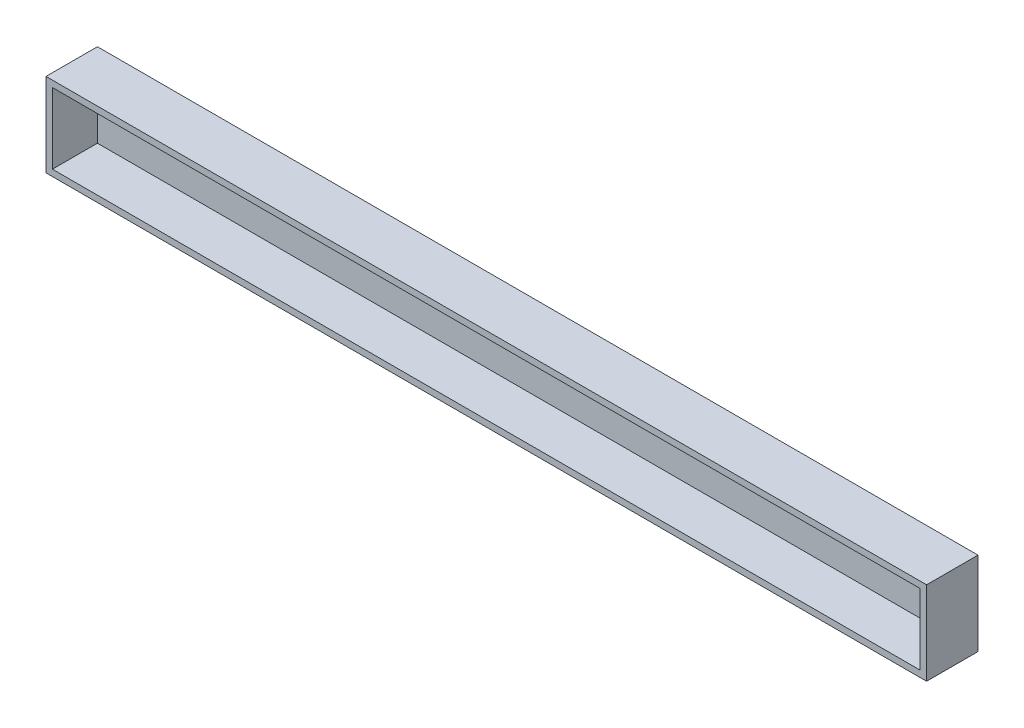
ISO-10303-21;
HEADER;
FILE_DESCRIPTION(('STEP AP214'),'2;1');
FILE_NAME('part.step','',(''),(''),'','','');
FILE_SCHEMA(('AUTOMOTIVE_DESIGN { 1 0 10303 214 1 1 1 1 }'));
ENDSEC;
DATA;
#1=APPLICATION_CONTEXT('core data for automotive mechanical design processes');
#2=APPLICATION_PROTOCOL_DEFINITION('international standard','automotive_design',2000,#1);
#3=PRODUCT_CONTEXT('',#1,'mechanical');
#4=PRODUCT('Part','Part','',(#3));
#5=PRODUCT_RELATED_PRODUCT_CATEGORY('part','',(#4));
#6=PRODUCT_DEFINITION_FORMATION('','',#4);
#7=PRODUCT_DEFINITION_CONTEXT('part definition',#1,'design');
#8=PRODUCT_DEFINITION('design','',#6,#7);
#9=PRODUCT_DEFINITION_SHAPE('','',#8);
#10=(LENGTH_UNIT() NAMED_UNIT(*) SI_UNIT(.MILLI.,.METRE.));
#11=(NAMED_UNIT(*) PLANE_ANGLE_UNIT() SI_UNIT($,.RADIAN.));
#12=(NAMED_UNIT(*) SI_UNIT($,.STERADIAN.) SOLID_ANGLE_UNIT());
#13=UNCERTAINTY_MEASURE_WITH_UNIT(LENGTH_MEASURE(1.E-05),#10,'distance_accuracy_value','');
#14=(GEOMETRIC_REPRESENTATION_CONTEXT(3) GLOBAL_UNCERTAINTY_ASSIGNED_CONTEXT((#13)) GLOBAL_UNIT_ASSIGNED_CONTEXT((#10,
#11,#12)) REPRESENTATION_CONTEXT('',''));
#15=CARTESIAN_POINT('',(0.,0.,0.));
#16=DIRECTION('',(0.,0.,1.));
#17=DIRECTION('',(1.,0.,0.));
#18=AXIS2_PLACEMENT_3D('',#15,#16,#17);
#19=CARTESIAN_POINT('',(0.,0.,8.));
#20=DIRECTION('',(0.,0.,-1.));
#21=DIRECTION('',(-1.,0.,0.));
#22=AXIS2_PLACEMENT_3D('',#19,#20,#21);
#23=PLANE('',#22);
#24=DIRECTION('',(0.,-1.,0.));
#25=VECTOR('',#24,1.);
#26=CARTESIAN_POINT('',(0.,0.,8.));
#27=LINE('',#26,#25);
#28=CARTESIAN_POINT('',(0.,13.,8.));
#29=VERTEX_POINT('',#28);
#30=CARTESIAN_POINT('',(0.,0.,8.));
#31=VERTEX_POINT('',#30);
#32=EDGE_CURVE('E145',#29,#31,#27,.T.);
#33=ORIENTED_EDGE('',*,*,#32,.T.);
#34=DIRECTION('',(1.,0.,0.));
#35=VECTOR('',#34,1.);
#36=CARTESIAN_POINT('',(0.,0.,8.));
#37=LINE('',#36,#35);
#38=CARTESIAN_POINT('',(137.,0.,8.));
#39=VERTEX_POINT('',#38);
#40=EDGE_CURVE('E150',#31,#39,#37,.T.);
#41=ORIENTED_EDGE('',*,*,#40,.T.);
#42=DIRECTION('',(0.,1.,0.));
#43=VECTOR('',#42,1.);
#44=CARTESIAN_POINT('',(137.,0.,8.));
#45=LINE('',#44,#43);
#46=CARTESIAN_POINT('',(137.,13.,8.));
#47=VERTEX_POINT('',#46);
#48=EDGE_CURVE('E147',#39,#47,#45,.T.);
#49=ORIENTED_EDGE('',*,*,#48,.T.);
#50=DIRECTION('',(-1.,0.,0.));
#51=VECTOR('',#50,1.);
#52=CARTESIAN_POINT('',(0.,13.,8.));
#53=LINE('',#52,#51);
#54=EDGE_CURVE('E155',#47,#29,#53,.T.);
#55=ORIENTED_EDGE('',*,*,#54,.T.);
#56=EDGE_LOOP('',(#33,#41,#49,#55));
#57=FACE_BOUND('',#56,.T.);
#58=DIRECTION('',(0.,-1.,0.));
#59=VECTOR('',#58,1.);
#60=CARTESIAN_POINT('',(1.,1.,8.));
#61=LINE('',#60,#59);
#62=CARTESIAN_POINT('',(1.,12.,8.));
#63=VERTEX_POINT('',#62);
#64=CARTESIAN_POINT('',(1.,1.,8.));
#65=VERTEX_POINT('',#64);
#66=EDGE_CURVE('E130',#63,#65,#61,.T.);
#67=ORIENTED_EDGE('',*,*,#66,.F.);
#68=DIRECTION('',(-1.,0.,0.));
#69=VECTOR('',#68,1.);
#70=CARTESIAN_POINT('',(1.,12.,8.));
#71=LINE('',#70,#69);
#72=CARTESIAN_POINT('',(136.,12.,8.));
#73=VERTEX_POINT('',#72);
#74=EDGE_CURVE('E113',#73,#63,#71,.T.);
#75=ORIENTED_EDGE('',*,*,#74,.F.);
#76=DIRECTION('',(0.,1.,0.));
#77=VECTOR('',#76,1.);
#78=CARTESIAN_POINT('',(136.,1.,8.));
#79=LINE('',#78,#77);
#80=CARTESIAN_POINT('',(136.,1.,8.));
#81=VERTEX_POINT('',#80);
#82=EDGE_CURVE('E133',#81,#73,#79,.T.);
#83=ORIENTED_EDGE('',*,*,#82,.F.);
#84=DIRECTION('',(1.,0.,0.));
#85=VECTOR('',#84,1.);
#86=CARTESIAN_POINT('',(1.,1.,8.));
#87=LINE('',#86,#85);
#88=EDGE_CURVE('E129',#65,#81,#87,.T.);
#89=ORIENTED_EDGE('',*,*,#88,.F.);
#90=EDGE_LOOP('',(#67,#75,#83,#89));
#91=FACE_BOUND('',#90,.T.);
#92=ADVANCED_FACE('F45',(#57,#91),#23,.F.);
#93=CARTESIAN_POINT('',(0.,0.,0.));
#94=DIRECTION('',(0.,0.,-1.));
#95=DIRECTION('',(-1.,0.,0.));
#96=AXIS2_PLACEMENT_3D('',#93,#94,#95);
#97=PLANE('',#96);
#98=DIRECTION('',(0.,-1.,0.));
#99=VECTOR('',#98,1.);
#100=CARTESIAN_POINT('',(0.,0.,0.));
#101=LINE('',#100,#99);
#102=CARTESIAN_POINT('',(0.,13.,0.));
#103=VERTEX_POINT('',#102);
#104=CARTESIAN_POINT('',(0.,0.,0.));
#105=VERTEX_POINT('',#104);
#106=EDGE_CURVE('E141',#103,#105,#101,.T.);
#107=ORIENTED_EDGE('',*,*,#106,.F.);
#108=DIRECTION('',(-1.,0.,0.));
#109=VECTOR('',#108,1.);
#110=CARTESIAN_POINT('',(0.,13.,0.));
#111=LINE('',#110,#109);
#112=CARTESIAN_POINT('',(137.,13.,0.));
#113=VERTEX_POINT('',#112);
#114=EDGE_CURVE('E146',#113,#103,#111,.T.);
#115=ORIENTED_EDGE('',*,*,#114,.F.);
#116=DIRECTION('',(0.,1.,0.));
#117=VECTOR('',#116,1.);
#118=CARTESIAN_POINT('',(137.,0.,0.));
#119=LINE('',#118,#117);
#120=CARTESIAN_POINT('',(137.,0.,0.));
#121=VERTEX_POINT('',#120);
#122=EDGE_CURVE('E157',#121,#113,#119,.T.);
#123=ORIENTED_EDGE('',*,*,#122,.F.);
#124=DIRECTION('',(1.,0.,0.));
#125=VECTOR('',#124,1.);
#126=CARTESIAN_POINT('',(0.,0.,0.));
#127=LINE('',#126,#125);
#128=EDGE_CURVE('E160',#105,#121,#127,.T.);
#129=ORIENTED_EDGE('',*,*,#128,.F.);
#130=EDGE_LOOP('',(#107,#115,#123,#129));
#131=FACE_BOUND('',#130,.T.);
#132=ADVANCED_FACE('F180',(#131),#97,.T.);
#133=CARTESIAN_POINT('',(0.,0.,8.));
#134=DIRECTION('',(1.,0.,0.));
#135=DIRECTION('',(0.,0.,-1.));
#136=AXIS2_PLACEMENT_3D('',#133,#134,#135);
#137=PLANE('',#136);
#138=ORIENTED_EDGE('',*,*,#106,.T.);
#139=DIRECTION('',(0.,0.,-1.));
#140=VECTOR('',#139,1.);
#141=CARTESIAN_POINT('',(0.,0.,8.));
#142=LINE('',#141,#140);
#143=EDGE_CURVE('E11',#31,#105,#142,.T.);
#144=ORIENTED_EDGE('',*,*,#143,.F.);
#145=ORIENTED_EDGE('',*,*,#32,.F.);
#146=DIRECTION('',(0.,0.,-1.));
#147=VECTOR('',#146,1.);
#148=CARTESIAN_POINT('',(0.,13.,8.));
#149=LINE('',#148,#147);
#150=EDGE_CURVE('E152',#29,#103,#149,.T.);
#151=ORIENTED_EDGE('',*,*,#150,.T.);
#152=EDGE_LOOP('',(#138,#144,#145,#151));
#153=FACE_BOUND('',#152,.T.);
#154=ADVANCED_FACE('F42',(#153),#137,.F.);
#155=CARTESIAN_POINT('',(0.,0.,8.));
#156=DIRECTION('',(0.,1.,0.));
#157=DIRECTION('',(0.,0.,1.));
#158=AXIS2_PLACEMENT_3D('',#155,#156,#157);
#159=PLANE('',#158);
#160=ORIENTED_EDGE('',*,*,#128,.T.);
#161=DIRECTION('',(0.,0.,-1.));
#162=VECTOR('',#161,1.);
#163=CARTESIAN_POINT('',(137.,0.,8.));
#164=LINE('',#163,#162);
#165=EDGE_CURVE('E49',#39,#121,#164,.T.);
#166=ORIENTED_EDGE('',*,*,#165,.F.);
#167=ORIENTED_EDGE('',*,*,#40,.F.);
#168=ORIENTED_EDGE('',*,*,#143,.T.);
#169=EDGE_LOOP('',(#160,#166,#167,#168));
#170=FACE_BOUND('',#169,.T.);
#171=ADVANCED_FACE('F190',(#170),#159,.F.);
#172=CARTESIAN_POINT('',(137.,0.,8.));
#173=DIRECTION('',(-1.,0.,0.));
#174=DIRECTION('',(0.,0.,1.));
#175=AXIS2_PLACEMENT_3D('',#172,#173,#174);
#176=PLANE('',#175);
#177=ORIENTED_EDGE('',*,*,#122,.T.);
#178=DIRECTION('',(0.,0.,-1.));
#179=VECTOR('',#178,1.);
#180=CARTESIAN_POINT('',(137.,13.,8.));
#181=LINE('',#180,#179);
#182=EDGE_CURVE('E163',#47,#113,#181,.T.);
#183=ORIENTED_EDGE('',*,*,#182,.F.);
#184=ORIENTED_EDGE('',*,*,#48,.F.);
#185=ORIENTED_EDGE('',*,*,#165,.T.);
#186=EDGE_LOOP('',(#177,#183,#184,#185));
#187=FACE_BOUND('',#186,.T.);
#188=ADVANCED_FACE('F172',(#187),#176,.F.);
#189=CARTESIAN_POINT('',(0.,13.,8.));
#190=DIRECTION('',(0.,-1.,0.));
#191=DIRECTION('',(0.,0.,-1.));
#192=AXIS2_PLACEMENT_3D('',#189,#190,#191);
#193=PLANE('',#192);
#194=ORIENTED_EDGE('',*,*,#114,.T.);
#195=ORIENTED_EDGE('',*,*,#150,.F.);
#196=ORIENTED_EDGE('',*,*,#54,.F.);
#197=ORIENTED_EDGE('',*,*,#182,.T.);
#198=EDGE_LOOP('',(#194,#195,#196,#197));
#199=FACE_BOUND('',#198,.T.);
#200=ADVANCED_FACE('F179',(#199),#193,.F.);
#201=CARTESIAN_POINT('',(1.,1.,8.));
#202=DIRECTION('',(1.,0.,0.));
#203=DIRECTION('',(0.,0.,-1.));
#204=AXIS2_PLACEMENT_3D('',#201,#202,#203);
#205=PLANE('',#204);
#206=DIRECTION('',(0.,-1.,0.));
#207=VECTOR('',#206,1.);
#208=CARTESIAN_POINT('',(1.,1.,1.));
#209=LINE('',#208,#207);
#210=CARTESIAN_POINT('',(1.,12.,1.));
#211=VERTEX_POINT('',#210);
#212=CARTESIAN_POINT('',(1.,1.,1.));
#213=VERTEX_POINT('',#212);
#214=EDGE_CURVE('E123',#211,#213,#209,.T.);
#215=ORIENTED_EDGE('',*,*,#214,.F.);
#216=DIRECTION('',(0.,0.,-1.));
#217=VECTOR('',#216,1.);
#218=CARTESIAN_POINT('',(1.,12.,8.));
#219=LINE('',#218,#217);
#220=EDGE_CURVE('E108',#63,#211,#219,.T.);
#221=ORIENTED_EDGE('',*,*,#220,.F.);
#222=ORIENTED_EDGE('',*,*,#66,.T.);
#223=DIRECTION('',(0.,0.,-1.));
#224=VECTOR('',#223,1.);
#225=CARTESIAN_POINT('',(1.,1.,8.));
#226=LINE('',#225,#224);
#227=EDGE_CURVE('E121',#65,#213,#226,.T.);
#228=ORIENTED_EDGE('',*,*,#227,.T.);
#229=EDGE_LOOP('',(#215,#221,#222,#228));
#230=FACE_BOUND('',#229,.T.);
#231=ADVANCED_FACE('F125',(#230),#205,.T.);
#232=CARTESIAN_POINT('',(1.,1.,8.));
#233=DIRECTION('',(0.,1.,0.));
#234=DIRECTION('',(0.,0.,1.));
#235=AXIS2_PLACEMENT_3D('',#232,#233,#234);
#236=PLANE('',#235);
#237=DIRECTION('',(1.,0.,0.));
#238=VECTOR('',#237,1.);
#239=CARTESIAN_POINT('',(1.,1.,1.));
#240=LINE('',#239,#238);
#241=CARTESIAN_POINT('',(136.,1.,1.));
#242=VERTEX_POINT('',#241);
#243=EDGE_CURVE('E60',#213,#242,#240,.T.);
#244=ORIENTED_EDGE('',*,*,#243,.F.);
#245=ORIENTED_EDGE('',*,*,#227,.F.);
#246=ORIENTED_EDGE('',*,*,#88,.T.);
#247=DIRECTION('',(0.,0.,-1.));
#248=VECTOR('',#247,1.);
#249=CARTESIAN_POINT('',(136.,1.,8.));
#250=LINE('',#249,#248);
#251=EDGE_CURVE('E138',#81,#242,#250,.T.);
#252=ORIENTED_EDGE('',*,*,#251,.T.);
#253=EDGE_LOOP('',(#244,#245,#246,#252));
#254=FACE_BOUND('',#253,.T.);
#255=ADVANCED_FACE('F210',(#254),#236,.T.);
#256=CARTESIAN_POINT('',(136.,1.,8.));
#257=DIRECTION('',(-1.,0.,0.));
#258=DIRECTION('',(0.,0.,1.));
#259=AXIS2_PLACEMENT_3D('',#256,#257,#258);
#260=PLANE('',#259);
#261=DIRECTION('',(0.,1.,0.));
#262=VECTOR('',#261,1.);
#263=CARTESIAN_POINT('',(136.,1.,1.));
#264=LINE('',#263,#262);
#265=CARTESIAN_POINT('',(136.,12.,1.));
#266=VERTEX_POINT('',#265);
#267=EDGE_CURVE('E63',#242,#266,#264,.T.);
#268=ORIENTED_EDGE('',*,*,#267,.F.);
#269=ORIENTED_EDGE('',*,*,#251,.F.);
#270=ORIENTED_EDGE('',*,*,#82,.T.);
#271=DIRECTION('',(0.,0.,-1.));
#272=VECTOR('',#271,1.);
#273=CARTESIAN_POINT('',(136.,12.,8.));
#274=LINE('',#273,#272);
#275=EDGE_CURVE('E119',#73,#266,#274,.T.);
#276=ORIENTED_EDGE('',*,*,#275,.T.);
#277=EDGE_LOOP('',(#268,#269,#270,#276));
#278=FACE_BOUND('',#277,.T.);
#279=ADVANCED_FACE('F211',(#278),#260,.T.);
#280=CARTESIAN_POINT('',(1.,12.,8.));
#281=DIRECTION('',(0.,-1.,0.));
#282=DIRECTION('',(0.,0.,-1.));
#283=AXIS2_PLACEMENT_3D('',#280,#281,#282);
#284=PLANE('',#283);
#285=DIRECTION('',(-1.,0.,0.));
#286=VECTOR('',#285,1.);
#287=CARTESIAN_POINT('',(1.,12.,1.));
#288=LINE('',#287,#286);
#289=EDGE_CURVE('E114',#266,#211,#288,.T.);
#290=ORIENTED_EDGE('',*,*,#289,.F.);
#291=ORIENTED_EDGE('',*,*,#275,.F.);
#292=ORIENTED_EDGE('',*,*,#74,.T.);
#293=ORIENTED_EDGE('',*,*,#220,.T.);
#294=EDGE_LOOP('',(#290,#291,#292,#293));
#295=FACE_BOUND('',#294,.T.);
#296=ADVANCED_FACE('F112',(#295),#284,.T.);
#297=CARTESIAN_POINT('',(0.,0.,1.));
#298=DIRECTION('',(0.,0.,-1.));
#299=DIRECTION('',(-1.,0.,0.));
#300=AXIS2_PLACEMENT_3D('',#297,#298,#299);
#301=PLANE('',#300);
#302=ORIENTED_EDGE('',*,*,#214,.T.);
#303=ORIENTED_EDGE('',*,*,#243,.T.);
#304=ORIENTED_EDGE('',*,*,#267,.T.);
#305=ORIENTED_EDGE('',*,*,#289,.T.);
#306=EDGE_LOOP('',(#302,#303,#304,#305));
#307=FACE_BOUND('',#306,.T.);
#308=ADVANCED_FACE('F127',(#307),#301,.F.);
#309=CLOSED_SHELL('',(#92,#132,#154,#171,#188,#200,#231,#255,#279,#296,#308));
#310=MANIFOLD_SOLID_BREP('B2',#309);
#311=ADVANCED_BREP_SHAPE_REPRESENTATION('',(#18,#310),#14);
#312=SHAPE_DEFINITION_REPRESENTATION(#9,#311);
ENDSEC;
END-ISO-10303-21;
